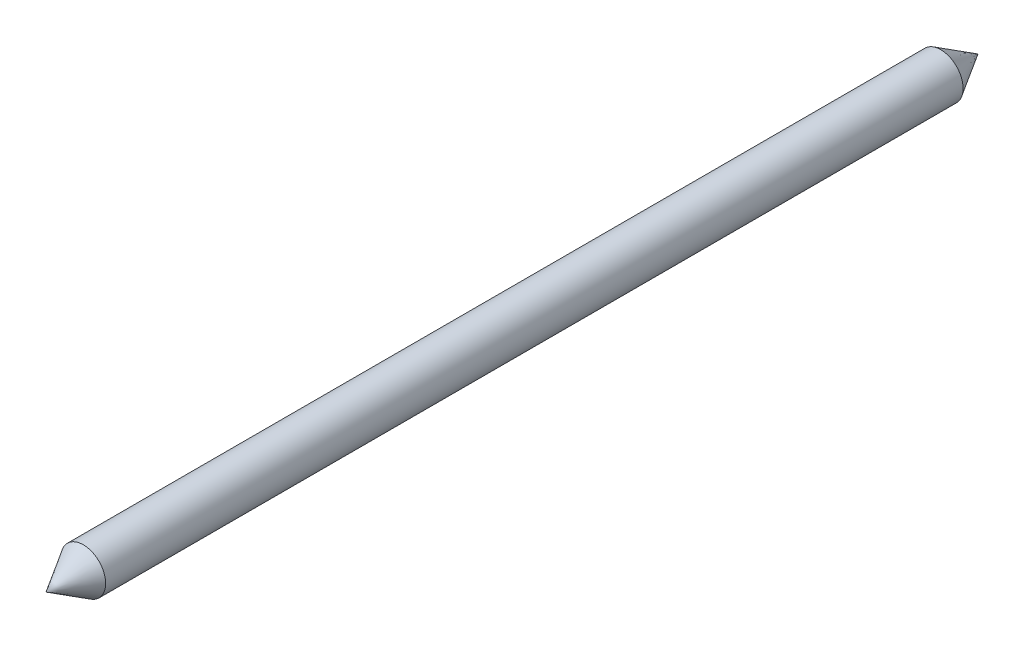
ISO-10303-21;
HEADER;
FILE_DESCRIPTION(('STEP AP214'),'2;1');
FILE_NAME('part.step','',(''),(''),'','','');
FILE_SCHEMA(('AUTOMOTIVE_DESIGN { 1 0 10303 214 1 1 1 1 }'));
ENDSEC;
DATA;
#1=APPLICATION_CONTEXT('core data for automotive mechanical design processes');
#2=APPLICATION_PROTOCOL_DEFINITION('international standard','automotive_design',2000,#1);
#3=PRODUCT_CONTEXT('',#1,'mechanical');
#4=PRODUCT('Part','Part','',(#3));
#5=PRODUCT_RELATED_PRODUCT_CATEGORY('part','',(#4));
#6=PRODUCT_DEFINITION_FORMATION('','',#4);
#7=PRODUCT_DEFINITION_CONTEXT('part definition',#1,'design');
#8=PRODUCT_DEFINITION('design','',#6,#7);
#9=PRODUCT_DEFINITION_SHAPE('','',#8);
#10=(LENGTH_UNIT() NAMED_UNIT(*) SI_UNIT(.MILLI.,.METRE.));
#11=(NAMED_UNIT(*) PLANE_ANGLE_UNIT() SI_UNIT($,.RADIAN.));
#12=(NAMED_UNIT(*) SI_UNIT($,.STERADIAN.) SOLID_ANGLE_UNIT());
#13=UNCERTAINTY_MEASURE_WITH_UNIT(LENGTH_MEASURE(1.E-05),#10,'distance_accuracy_value','');
#14=(GEOMETRIC_REPRESENTATION_CONTEXT(3) GLOBAL_UNCERTAINTY_ASSIGNED_CONTEXT((#13)) GLOBAL_UNIT_ASSIGNED_CONTEXT((#10,
#11,#12)) REPRESENTATION_CONTEXT('',''));
#15=CARTESIAN_POINT('',(0.,0.,0.));
#16=DIRECTION('',(0.,0.,1.));
#17=DIRECTION('',(1.,0.,0.));
#18=AXIS2_PLACEMENT_3D('',#15,#16,#17);
#19=CARTESIAN_POINT('',(0.,0.,-146.05));
#20=DIRECTION('',(0.,0.,1.));
#21=DIRECTION('',(1.,0.,0.));
#22=AXIS2_PLACEMENT_3D('',#19,#20,#21);
#23=CONICAL_SURFACE('',#22,7.62000000000006,0.540419500270588);
#24=CARTESIAN_POINT('',(0.,0.,-158.75));
#25=VERTEX_POINT('',#24);
#26=VERTEX_LOOP('',#25);
#27=FACE_BOUND('',#26,.T.);
#28=CARTESIAN_POINT('',(0.,0.,-146.05));
#29=DIRECTION('',(0.,0.,-1.));
#30=DIRECTION('',(-1.,0.,0.));
#31=AXIS2_PLACEMENT_3D('',#28,#29,#30);
#32=CIRCLE('',#31,7.62000000000006);
#33=CARTESIAN_POINT('',(-7.62000000000011,0.,-146.05));
#34=VERTEX_POINT('',#33);
#35=EDGE_CURVE('E11',#34,#34,#32,.T.);
#36=ORIENTED_EDGE('',*,*,#35,.T.);
#37=EDGE_LOOP('',(#36));
#38=FACE_BOUND('',#37,.T.);
#39=ADVANCED_FACE('F45',(#27,#38),#23,.T.);
#40=CARTESIAN_POINT('',(0.,0.,-158.75));
#41=DIRECTION('',(0.,0.,-1.));
#42=DIRECTION('',(-1.,0.,0.));
#43=AXIS2_PLACEMENT_3D('',#40,#41,#42);
#44=CYLINDRICAL_SURFACE('',#43,7.62000000000003);
#45=ORIENTED_EDGE('',*,*,#35,.F.);
#46=EDGE_LOOP('',(#45));
#47=FACE_BOUND('',#46,.T.);
#48=CARTESIAN_POINT('',(0.,0.,146.05));
#49=DIRECTION('',(0.,0.,-1.));
#50=DIRECTION('',(-1.,0.,0.));
#51=AXIS2_PLACEMENT_3D('',#48,#49,#50);
#52=CIRCLE('',#51,7.62);
#53=CARTESIAN_POINT('',(-7.61999999999997,0.,146.05));
#54=VERTEX_POINT('',#53);
#55=EDGE_CURVE('E53',#54,#54,#52,.T.);
#56=ORIENTED_EDGE('',*,*,#55,.T.);
#57=EDGE_LOOP('',(#56));
#58=FACE_BOUND('',#57,.T.);
#59=ADVANCED_FACE('F61',(#47,#58),#44,.T.);
#60=CARTESIAN_POINT('',(0.,0.,158.75));
#61=DIRECTION('',(0.,0.,-1.));
#62=DIRECTION('',(-1.,0.,0.));
#63=AXIS2_PLACEMENT_3D('',#60,#61,#62);
#64=CONICAL_SURFACE('',#63,0.,0.540419500270585);
#65=ORIENTED_EDGE('',*,*,#55,.F.);
#66=EDGE_LOOP('',(#65));
#67=FACE_BOUND('',#66,.T.);
#68=CARTESIAN_POINT('',(0.,0.,158.75));
#69=VERTEX_POINT('',#68);
#70=VERTEX_LOOP('',#69);
#71=FACE_BOUND('',#70,.T.);
#72=ADVANCED_FACE('F66',(#67,#71),#64,.T.);
#73=CLOSED_SHELL('',(#39,#59,#72));
#74=MANIFOLD_SOLID_BREP('B2',#73);
#75=ADVANCED_BREP_SHAPE_REPRESENTATION('',(#18,#74),#14);
#76=SHAPE_DEFINITION_REPRESENTATION(#9,#75);
ENDSEC;
END-ISO-10303-21;
